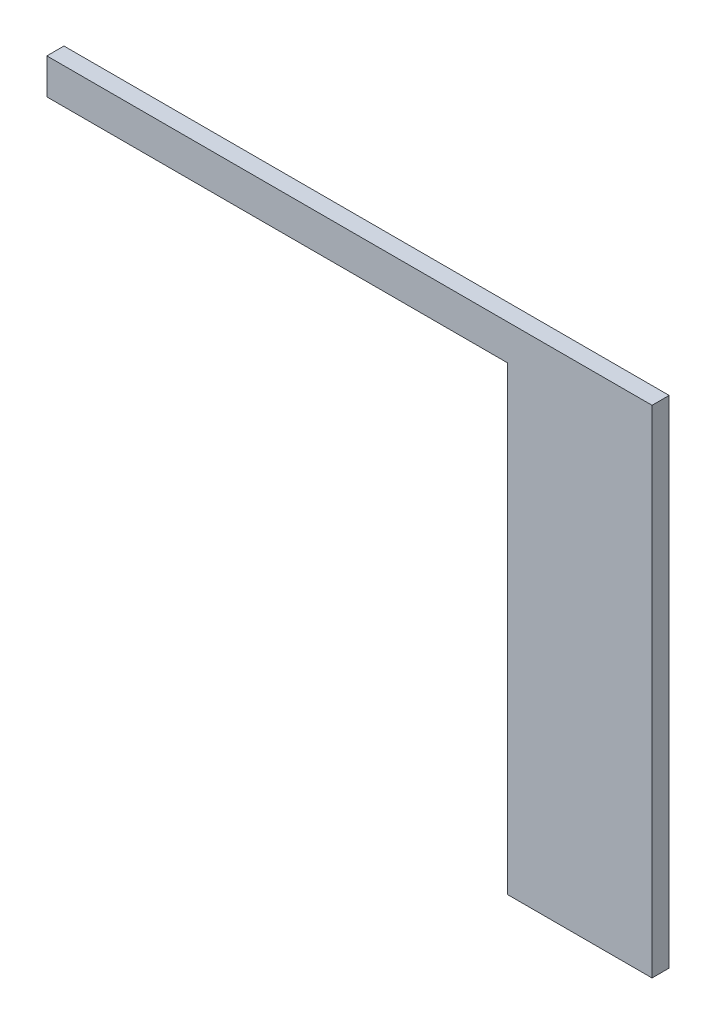
ISO-10303-21;
HEADER;
FILE_DESCRIPTION(('STEP AP214'),'2;1');
FILE_NAME('part.step','',(''),(''),'','','');
FILE_SCHEMA(('AUTOMOTIVE_DESIGN { 1 0 10303 214 1 1 1 1 }'));
ENDSEC;
DATA;
#1=APPLICATION_CONTEXT('core data for automotive mechanical design processes');
#2=APPLICATION_PROTOCOL_DEFINITION('international standard','automotive_design',2000,#1);
#3=PRODUCT_CONTEXT('',#1,'mechanical');
#4=PRODUCT('Part','Part','',(#3));
#5=PRODUCT_RELATED_PRODUCT_CATEGORY('part','',(#4));
#6=PRODUCT_DEFINITION_FORMATION('','',#4);
#7=PRODUCT_DEFINITION_CONTEXT('part definition',#1,'design');
#8=PRODUCT_DEFINITION('design','',#6,#7);
#9=PRODUCT_DEFINITION_SHAPE('','',#8);
#10=(LENGTH_UNIT() NAMED_UNIT(*) SI_UNIT(.MILLI.,.METRE.));
#11=(NAMED_UNIT(*) PLANE_ANGLE_UNIT() SI_UNIT($,.RADIAN.));
#12=(NAMED_UNIT(*) SI_UNIT($,.STERADIAN.) SOLID_ANGLE_UNIT());
#13=UNCERTAINTY_MEASURE_WITH_UNIT(LENGTH_MEASURE(1.E-05),#10,'distance_accuracy_value','');
#14=(GEOMETRIC_REPRESENTATION_CONTEXT(3) GLOBAL_UNCERTAINTY_ASSIGNED_CONTEXT((#13)) GLOBAL_UNIT_ASSIGNED_CONTEXT((#10,
#11,#12)) REPRESENTATION_CONTEXT('',''));
#15=CARTESIAN_POINT('',(0.,0.,0.));
#16=DIRECTION('',(0.,0.,1.));
#17=DIRECTION('',(1.,0.,0.));
#18=AXIS2_PLACEMENT_3D('',#15,#16,#17);
#19=CARTESIAN_POINT('',(5.00000000000001,-15.,0.5));
#20=DIRECTION('',(0.,1.,0.));
#21=DIRECTION('',(0.,0.,1.));
#22=AXIS2_PLACEMENT_3D('',#19,#20,#21);
#23=PLANE('',#22);
#24=DIRECTION('',(1.,0.,0.));
#25=VECTOR('',#24,1.);
#26=CARTESIAN_POINT('',(5.00000000000001,-15.,0.));
#27=LINE('',#26,#25);
#28=CARTESIAN_POINT('',(5.00000000000001,-15.,0.));
#29=VERTEX_POINT('',#28);
#30=CARTESIAN_POINT('',(9.23076923076924,-15.,0.));
#31=VERTEX_POINT('',#30);
#32=EDGE_CURVE('E108',#29,#31,#27,.T.);
#33=ORIENTED_EDGE('',*,*,#32,.T.);
#34=DIRECTION('',(0.,0.,-1.));
#35=VECTOR('',#34,1.);
#36=CARTESIAN_POINT('',(9.23076923076924,-15.,0.5));
#37=LINE('',#36,#35);
#38=CARTESIAN_POINT('',(9.23076923076924,-15.,0.5));
#39=VERTEX_POINT('',#38);
#40=EDGE_CURVE('E50',#39,#31,#37,.T.);
#41=ORIENTED_EDGE('',*,*,#40,.F.);
#42=DIRECTION('',(1.,0.,0.));
#43=VECTOR('',#42,1.);
#44=CARTESIAN_POINT('',(5.00000000000001,-15.,0.5));
#45=LINE('',#44,#43);
#46=CARTESIAN_POINT('',(5.00000000000001,-15.,0.5));
#47=VERTEX_POINT('',#46);
#48=EDGE_CURVE('E103',#47,#39,#45,.T.);
#49=ORIENTED_EDGE('',*,*,#48,.F.);
#50=DIRECTION('',(0.,0.,-1.));
#51=VECTOR('',#50,1.);
#52=CARTESIAN_POINT('',(5.00000000000001,-15.,0.5));
#53=LINE('',#52,#51);
#54=EDGE_CURVE('E99',#47,#29,#53,.T.);
#55=ORIENTED_EDGE('',*,*,#54,.T.);
#56=EDGE_LOOP('',(#33,#41,#49,#55));
#57=FACE_BOUND('',#56,.T.);
#58=ADVANCED_FACE('F39',(#57),#23,.F.);
#59=CARTESIAN_POINT('',(5.00000000000001,-1.53846153846154,0.5));
#60=DIRECTION('',(1.,0.,0.));
#61=DIRECTION('',(0.,0.,-1.));
#62=AXIS2_PLACEMENT_3D('',#59,#60,#61);
#63=PLANE('',#62);
#64=DIRECTION('',(0.,-1.,0.));
#65=VECTOR('',#64,1.);
#66=CARTESIAN_POINT('',(5.00000000000001,-1.53846153846154,0.));
#67=LINE('',#66,#65);
#68=CARTESIAN_POINT('',(5.00000000000001,-1.53846153846154,0.));
#69=VERTEX_POINT('',#68);
#70=EDGE_CURVE('E96',#69,#29,#67,.T.);
#71=ORIENTED_EDGE('',*,*,#70,.T.);
#72=ORIENTED_EDGE('',*,*,#54,.F.);
#73=DIRECTION('',(0.,-1.,0.));
#74=VECTOR('',#73,1.);
#75=CARTESIAN_POINT('',(5.00000000000001,-1.53846153846154,0.5));
#76=LINE('',#75,#74);
#77=CARTESIAN_POINT('',(5.00000000000001,-1.53846153846154,0.5));
#78=VERTEX_POINT('',#77);
#79=EDGE_CURVE('E115',#78,#47,#76,.T.);
#80=ORIENTED_EDGE('',*,*,#79,.F.);
#81=DIRECTION('',(0.,0.,-1.));
#82=VECTOR('',#81,1.);
#83=CARTESIAN_POINT('',(5.00000000000001,-1.53846153846154,0.5));
#84=LINE('',#83,#82);
#85=EDGE_CURVE('E105',#78,#69,#84,.T.);
#86=ORIENTED_EDGE('',*,*,#85,.T.);
#87=EDGE_LOOP('',(#71,#72,#80,#86));
#88=FACE_BOUND('',#87,.T.);
#89=ADVANCED_FACE('F97',(#88),#63,.F.);
#90=CARTESIAN_POINT('',(-8.46153846153845,-1.53846153846154,0.5));
#91=DIRECTION('',(0.,1.,0.));
#92=DIRECTION('',(0.,0.,1.));
#93=AXIS2_PLACEMENT_3D('',#90,#91,#92);
#94=PLANE('',#93);
#95=DIRECTION('',(1.,0.,0.));
#96=VECTOR('',#95,1.);
#97=CARTESIAN_POINT('',(-8.46153846153845,-1.53846153846154,0.));
#98=LINE('',#97,#96);
#99=CARTESIAN_POINT('',(-8.46153846153845,-1.53846153846154,0.));
#100=VERTEX_POINT('',#99);
#101=EDGE_CURVE('E89',#100,#69,#98,.T.);
#102=ORIENTED_EDGE('',*,*,#101,.T.);
#103=ORIENTED_EDGE('',*,*,#85,.F.);
#104=DIRECTION('',(1.,0.,0.));
#105=VECTOR('',#104,1.);
#106=CARTESIAN_POINT('',(-8.46153846153845,-1.53846153846154,0.5));
#107=LINE('',#106,#105);
#108=CARTESIAN_POINT('',(-8.46153846153845,-1.53846153846154,0.5));
#109=VERTEX_POINT('',#108);
#110=EDGE_CURVE('E139',#109,#78,#107,.T.);
#111=ORIENTED_EDGE('',*,*,#110,.F.);
#112=DIRECTION('',(0.,0.,-1.));
#113=VECTOR('',#112,1.);
#114=CARTESIAN_POINT('',(-8.46153846153845,-1.53846153846154,0.5));
#115=LINE('',#114,#113);
#116=EDGE_CURVE('E126',#109,#100,#115,.T.);
#117=ORIENTED_EDGE('',*,*,#116,.T.);
#118=EDGE_LOOP('',(#102,#103,#111,#117));
#119=FACE_BOUND('',#118,.T.);
#120=ADVANCED_FACE('F143',(#119),#94,.F.);
#121=CARTESIAN_POINT('',(0.,0.,0.5));
#122=DIRECTION('',(0.,0.,1.));
#123=DIRECTION('',(1.,0.,0.));
#124=AXIS2_PLACEMENT_3D('',#121,#122,#123);
#125=PLANE('',#124);
#126=DIRECTION('',(1.,0.,0.));
#127=VECTOR('',#126,1.);
#128=CARTESIAN_POINT('',(0.,-0.5,0.5));
#129=LINE('',#128,#127);
#130=CARTESIAN_POINT('',(-8.46153846153845,-0.499999999999999,0.5));
#131=VERTEX_POINT('',#130);
#132=CARTESIAN_POINT('',(9.23076923076924,-0.5,0.5));
#133=VERTEX_POINT('',#132);
#134=EDGE_CURVE('E68',#131,#133,#129,.T.);
#135=ORIENTED_EDGE('',*,*,#134,.F.);
#136=DIRECTION('',(0.,-1.,0.));
#137=VECTOR('',#136,1.);
#138=CARTESIAN_POINT('',(-8.46153846153845,1.92307692307692,0.5));
#139=LINE('',#138,#137);
#140=EDGE_CURVE('E132',#131,#109,#139,.T.);
#141=ORIENTED_EDGE('',*,*,#140,.T.);
#142=ORIENTED_EDGE('',*,*,#110,.T.);
#143=ORIENTED_EDGE('',*,*,#79,.T.);
#144=ORIENTED_EDGE('',*,*,#48,.T.);
#145=DIRECTION('',(0.,1.,0.));
#146=VECTOR('',#145,1.);
#147=CARTESIAN_POINT('',(9.23076923076924,-15.,0.5));
#148=LINE('',#147,#146);
#149=EDGE_CURVE('E135',#39,#133,#148,.T.);
#150=ORIENTED_EDGE('',*,*,#149,.T.);
#151=EDGE_LOOP('',(#135,#141,#142,#143,#144,#150));
#152=FACE_BOUND('',#151,.T.);
#153=ADVANCED_FACE('F136',(#152),#125,.T.);
#154=CARTESIAN_POINT('',(-8.46153846153845,1.92307692307692,0.5));
#155=DIRECTION('',(1.,0.,0.));
#156=DIRECTION('',(0.,0.,-1.));
#157=AXIS2_PLACEMENT_3D('',#154,#155,#156);
#158=PLANE('',#157);
#159=ORIENTED_EDGE('',*,*,#140,.F.);
#160=DIRECTION('',(0.,0.,-1.));
#161=VECTOR('',#160,1.);
#162=CARTESIAN_POINT('',(-8.46153846153845,-0.5,0.5));
#163=LINE('',#162,#161);
#164=CARTESIAN_POINT('',(-8.46153846153845,-0.5,0.));
#165=VERTEX_POINT('',#164);
#166=EDGE_CURVE('E53',#131,#165,#163,.T.);
#167=ORIENTED_EDGE('',*,*,#166,.T.);
#168=DIRECTION('',(0.,-1.,0.));
#169=VECTOR('',#168,1.);
#170=CARTESIAN_POINT('',(-8.46153846153845,1.92307692307692,0.));
#171=LINE('',#170,#169);
#172=EDGE_CURVE('E116',#165,#100,#171,.T.);
#173=ORIENTED_EDGE('',*,*,#172,.T.);
#174=ORIENTED_EDGE('',*,*,#116,.F.);
#175=EDGE_LOOP('',(#159,#167,#173,#174));
#176=FACE_BOUND('',#175,.T.);
#177=ADVANCED_FACE('F155',(#176),#158,.F.);
#178=CARTESIAN_POINT('',(9.23076923076924,-15.,0.5));
#179=DIRECTION('',(-1.,0.,0.));
#180=DIRECTION('',(0.,0.,1.));
#181=AXIS2_PLACEMENT_3D('',#178,#179,#180);
#182=PLANE('',#181);
#183=DIRECTION('',(0.,1.,0.));
#184=VECTOR('',#183,1.);
#185=CARTESIAN_POINT('',(9.23076923076924,-15.,0.));
#186=LINE('',#185,#184);
#187=CARTESIAN_POINT('',(9.23076923076924,-0.5,0.));
#188=VERTEX_POINT('',#187);
#189=EDGE_CURVE('E117',#31,#188,#186,.T.);
#190=ORIENTED_EDGE('',*,*,#189,.T.);
#191=DIRECTION('',(0.,0.,1.));
#192=VECTOR('',#191,1.);
#193=CARTESIAN_POINT('',(9.23076923076924,-0.5,0.5));
#194=LINE('',#193,#192);
#195=EDGE_CURVE('E63',#188,#133,#194,.T.);
#196=ORIENTED_EDGE('',*,*,#195,.T.);
#197=ORIENTED_EDGE('',*,*,#149,.F.);
#198=ORIENTED_EDGE('',*,*,#40,.T.);
#199=EDGE_LOOP('',(#190,#196,#197,#198));
#200=FACE_BOUND('',#199,.T.);
#201=ADVANCED_FACE('F127',(#200),#182,.F.);
#202=CARTESIAN_POINT('',(0.,0.,0.));
#203=DIRECTION('',(0.,0.,1.));
#204=DIRECTION('',(1.,0.,0.));
#205=AXIS2_PLACEMENT_3D('',#202,#203,#204);
#206=PLANE('',#205);
#207=DIRECTION('',(-1.,0.,0.));
#208=VECTOR('',#207,1.);
#209=CARTESIAN_POINT('',(-17.,-0.5,0.));
#210=LINE('',#209,#208);
#211=EDGE_CURVE('E11',#188,#165,#210,.T.);
#212=ORIENTED_EDGE('',*,*,#211,.F.);
#213=ORIENTED_EDGE('',*,*,#189,.F.);
#214=ORIENTED_EDGE('',*,*,#32,.F.);
#215=ORIENTED_EDGE('',*,*,#70,.F.);
#216=ORIENTED_EDGE('',*,*,#101,.F.);
#217=ORIENTED_EDGE('',*,*,#172,.F.);
#218=EDGE_LOOP('',(#212,#213,#214,#215,#216,#217));
#219=FACE_BOUND('',#218,.T.);
#220=ADVANCED_FACE('F114',(#219),#206,.F.);
#221=CARTESIAN_POINT('',(-17.,-0.5,1.));
#222=DIRECTION('',(0.,-1.,0.));
#223=DIRECTION('',(0.,0.,-1.));
#224=AXIS2_PLACEMENT_3D('',#221,#222,#223);
#225=PLANE('',#224);
#226=ORIENTED_EDGE('',*,*,#211,.T.);
#227=ORIENTED_EDGE('',*,*,#166,.F.);
#228=ORIENTED_EDGE('',*,*,#134,.T.);
#229=ORIENTED_EDGE('',*,*,#195,.F.);
#230=EDGE_LOOP('',(#226,#227,#228,#229));
#231=FACE_BOUND('',#230,.T.);
#232=ADVANCED_FACE('F258',(#231),#225,.F.);
#233=CLOSED_SHELL('',(#58,#89,#120,#153,#177,#201,#220,#232));
#234=MANIFOLD_SOLID_BREP('B2',#233);
#235=ADVANCED_BREP_SHAPE_REPRESENTATION('',(#18,#234),#14);
#236=SHAPE_DEFINITION_REPRESENTATION(#9,#235);
ENDSEC;
END-ISO-10303-21;
